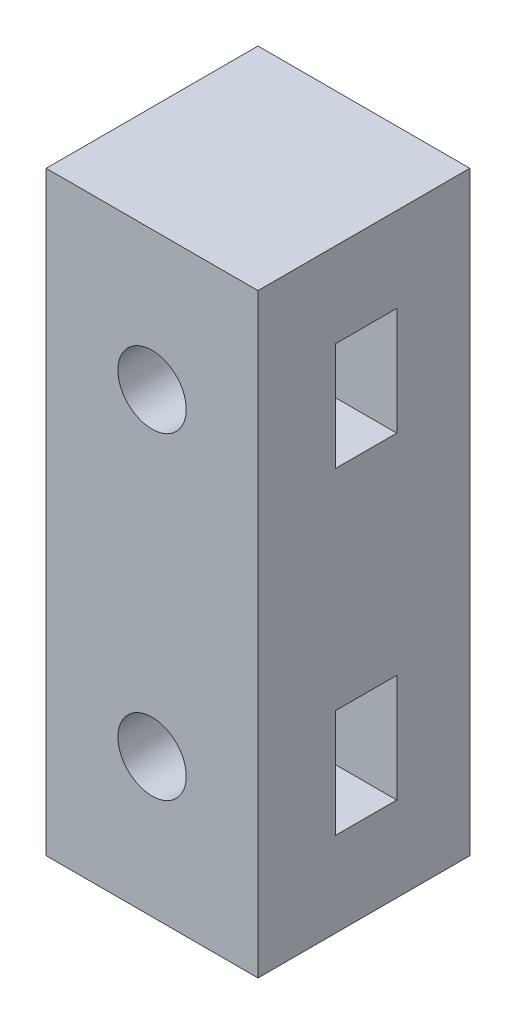
ISO-10303-21;
HEADER;
FILE_DESCRIPTION(('STEP AP214'),'2;1');
FILE_NAME('part.step','',(''),(''),'','','');
FILE_SCHEMA(('AUTOMOTIVE_DESIGN { 1 0 10303 214 1 1 1 1 }'));
ENDSEC;
DATA;
#1=APPLICATION_CONTEXT('core data for automotive mechanical design processes');
#2=APPLICATION_PROTOCOL_DEFINITION('international standard','automotive_design',2000,#1);
#3=PRODUCT_CONTEXT('',#1,'mechanical');
#4=PRODUCT('Part','Part','',(#3));
#5=PRODUCT_RELATED_PRODUCT_CATEGORY('part','',(#4));
#6=PRODUCT_DEFINITION_FORMATION('','',#4);
#7=PRODUCT_DEFINITION_CONTEXT('part definition',#1,'design');
#8=PRODUCT_DEFINITION('design','',#6,#7);
#9=PRODUCT_DEFINITION_SHAPE('','',#8);
#10=(LENGTH_UNIT() NAMED_UNIT(*) SI_UNIT(.MILLI.,.METRE.));
#11=(NAMED_UNIT(*) PLANE_ANGLE_UNIT() SI_UNIT($,.RADIAN.));
#12=(NAMED_UNIT(*) SI_UNIT($,.STERADIAN.) SOLID_ANGLE_UNIT());
#13=UNCERTAINTY_MEASURE_WITH_UNIT(LENGTH_MEASURE(1.E-05),#10,'distance_accuracy_value','');
#14=(GEOMETRIC_REPRESENTATION_CONTEXT(3) GLOBAL_UNCERTAINTY_ASSIGNED_CONTEXT((#13)) GLOBAL_UNIT_ASSIGNED_CONTEXT((#10,
#11,#12)) REPRESENTATION_CONTEXT('',''));
#15=CARTESIAN_POINT('',(0.,0.,0.));
#16=DIRECTION('',(0.,0.,1.));
#17=DIRECTION('',(1.,0.,0.));
#18=AXIS2_PLACEMENT_3D('',#15,#16,#17);
#19=CARTESIAN_POINT('',(25.4,71.374,0.));
#20=DIRECTION('',(-1.,0.,0.));
#21=DIRECTION('',(0.,0.,1.));
#22=AXIS2_PLACEMENT_3D('',#19,#20,#21);
#23=PLANE('',#22);
#24=DIRECTION('',(0.,1.,0.));
#25=VECTOR('',#24,1.);
#26=CARTESIAN_POINT('',(25.4,0.,-9.271));
#27=LINE('',#26,#25);
#28=CARTESIAN_POINT('',(25.4,10.16,-9.271));
#29=VERTEX_POINT('',#28);
#30=CARTESIAN_POINT('',(25.4,23.114,-9.271));
#31=VERTEX_POINT('',#30);
#32=EDGE_CURVE('E81',#29,#31,#27,.T.);
#33=ORIENTED_EDGE('',*,*,#32,.T.);
#34=DIRECTION('',(0.,0.,-1.));
#35=VECTOR('',#34,1.);
#36=CARTESIAN_POINT('',(25.4,23.114,0.));
#37=LINE('',#36,#35);
#38=CARTESIAN_POINT('',(25.4,23.114,-16.637));
#39=VERTEX_POINT('',#38);
#40=EDGE_CURVE('E191',#31,#39,#37,.T.);
#41=ORIENTED_EDGE('',*,*,#40,.T.);
#42=DIRECTION('',(0.,1.,0.));
#43=VECTOR('',#42,1.);
#44=CARTESIAN_POINT('',(25.4,0.,-16.637));
#45=LINE('',#44,#43);
#46=CARTESIAN_POINT('',(25.4,10.16,-16.637));
#47=VERTEX_POINT('',#46);
#48=EDGE_CURVE('E204',#47,#39,#45,.T.);
#49=ORIENTED_EDGE('',*,*,#48,.F.);
#50=DIRECTION('',(0.,0.,-1.));
#51=VECTOR('',#50,1.);
#52=CARTESIAN_POINT('',(25.4,10.16,0.));
#53=LINE('',#52,#51);
#54=EDGE_CURVE('E201',#29,#47,#53,.T.);
#55=ORIENTED_EDGE('',*,*,#54,.F.);
#56=EDGE_LOOP('',(#33,#41,#49,#55));
#57=FACE_BOUND('',#56,.T.);
#58=DIRECTION('',(0.,0.,-1.));
#59=VECTOR('',#58,1.);
#60=CARTESIAN_POINT('',(25.4,0.,0.));
#61=LINE('',#60,#59);
#62=CARTESIAN_POINT('',(25.4,0.,0.));
#63=VERTEX_POINT('',#62);
#64=CARTESIAN_POINT('',(25.4,0.,-25.4));
#65=VERTEX_POINT('',#64);
#66=EDGE_CURVE('E246',#63,#65,#61,.T.);
#67=ORIENTED_EDGE('',*,*,#66,.T.);
#68=DIRECTION('',(0.,-1.,0.));
#69=VECTOR('',#68,1.);
#70=CARTESIAN_POINT('',(25.4,71.374,-25.4));
#71=LINE('',#70,#69);
#72=CARTESIAN_POINT('',(25.4,71.374,-25.4));
#73=VERTEX_POINT('',#72);
#74=EDGE_CURVE('E65',#73,#65,#71,.T.);
#75=ORIENTED_EDGE('',*,*,#74,.F.);
#76=DIRECTION('',(0.,0.,-1.));
#77=VECTOR('',#76,1.);
#78=CARTESIAN_POINT('',(25.4,71.374,0.));
#79=LINE('',#78,#77);
#80=CARTESIAN_POINT('',(25.4,71.374,0.));
#81=VERTEX_POINT('',#80);
#82=EDGE_CURVE('E234',#81,#73,#79,.T.);
#83=ORIENTED_EDGE('',*,*,#82,.F.);
#84=DIRECTION('',(0.,-1.,0.));
#85=VECTOR('',#84,1.);
#86=CARTESIAN_POINT('',(25.4,71.374,0.));
#87=LINE('',#86,#85);
#88=EDGE_CURVE('E12',#81,#63,#87,.T.);
#89=ORIENTED_EDGE('',*,*,#88,.T.);
#90=EDGE_LOOP('',(#67,#75,#83,#89));
#91=FACE_BOUND('',#90,.T.);
#92=DIRECTION('',(0.,0.,-1.));
#93=VECTOR('',#92,1.);
#94=CARTESIAN_POINT('',(25.4,61.214,0.));
#95=LINE('',#94,#93);
#96=CARTESIAN_POINT('',(25.4,61.214,-9.271));
#97=VERTEX_POINT('',#96);
#98=CARTESIAN_POINT('',(25.4,61.214,-16.637));
#99=VERTEX_POINT('',#98);
#100=EDGE_CURVE('E158',#97,#99,#95,.T.);
#101=ORIENTED_EDGE('',*,*,#100,.T.);
#102=DIRECTION('',(0.,-1.,0.));
#103=VECTOR('',#102,1.);
#104=CARTESIAN_POINT('',(25.4,61.214,-16.637));
#105=LINE('',#104,#103);
#106=CARTESIAN_POINT('',(25.4,48.26,-16.637));
#107=VERTEX_POINT('',#106);
#108=EDGE_CURVE('E154',#99,#107,#105,.T.);
#109=ORIENTED_EDGE('',*,*,#108,.T.);
#110=DIRECTION('',(0.,0.,-1.));
#111=VECTOR('',#110,1.);
#112=CARTESIAN_POINT('',(25.4,48.26,-9.271));
#113=LINE('',#112,#111);
#114=CARTESIAN_POINT('',(25.4,48.26,-9.271));
#115=VERTEX_POINT('',#114);
#116=EDGE_CURVE('E161',#115,#107,#113,.T.);
#117=ORIENTED_EDGE('',*,*,#116,.F.);
#118=DIRECTION('',(0.,-1.,0.));
#119=VECTOR('',#118,1.);
#120=CARTESIAN_POINT('',(25.4,61.214,-9.271));
#121=LINE('',#120,#119);
#122=EDGE_CURVE('E165',#97,#115,#121,.T.);
#123=ORIENTED_EDGE('',*,*,#122,.F.);
#124=EDGE_LOOP('',(#101,#109,#117,#123));
#125=FACE_BOUND('',#124,.T.);
#126=ADVANCED_FACE('F56',(#57,#91,#125),#23,.F.);
#127=CARTESIAN_POINT('',(12.7,16.637,-19.05));
#128=DIRECTION('',(0.,0.,1.));
#129=DIRECTION('',(1.,0.,0.));
#130=AXIS2_PLACEMENT_3D('',#127,#128,#129);
#131=CYLINDRICAL_SURFACE('',#130,4.09575);
#132=CARTESIAN_POINT('',(12.7,16.637,0.));
#133=DIRECTION('',(0.,0.,1.));
#134=DIRECTION('',(1.,0.,0.));
#135=AXIS2_PLACEMENT_3D('',#132,#133,#134);
#136=CIRCLE('',#135,4.09575);
#137=CARTESIAN_POINT('',(16.79575,16.637,0.));
#138=VERTEX_POINT('',#137);
#139=EDGE_CURVE('E221',#138,#138,#136,.T.);
#140=CARTESIAN_POINT('',(12.7,16.637,-9.271));
#141=DIRECTION('',(0.,0.,-1.));
#142=DIRECTION('',(0.,1.,0.));
#143=AXIS2_PLACEMENT_3D('',#140,#141,#142);
#144=CIRCLE('',#143,4.09575);
#145=CARTESIAN_POINT('',(16.79575,16.637,-9.271));
#146=VERTEX_POINT('',#145);
#147=EDGE_CURVE('E224',#146,#146,#144,.F.);
#148=CARTESIAN_POINT('',(16.79575,16.637,0.));
#149=CARTESIAN_POINT('',(16.79575,16.637,-0.096572916666667));
#150=CARTESIAN_POINT('',(16.79575,16.637,-0.193145833333334));
#151=CARTESIAN_POINT('',(16.79575,16.637,-0.386291666666668));
#152=CARTESIAN_POINT('',(16.79575,16.637,-0.482864583333335));
#153=CARTESIAN_POINT('',(16.79575,16.637,-0.676010416666668));
#154=CARTESIAN_POINT('',(16.79575,16.637,-0.772583333333333));
#155=CARTESIAN_POINT('',(16.79575,16.637,-0.965729166666666));
#156=CARTESIAN_POINT('',(16.79575,16.637,-1.06230208333333));
#157=CARTESIAN_POINT('',(16.79575,16.637,-1.25544791666667));
#158=CARTESIAN_POINT('',(16.79575,16.637,-1.35202083333333));
#159=CARTESIAN_POINT('',(16.79575,16.637,-1.54516666666667));
#160=CARTESIAN_POINT('',(16.79575,16.637,-1.64173958333334));
#161=CARTESIAN_POINT('',(16.79575,16.637,-1.83488541666667));
#162=CARTESIAN_POINT('',(16.79575,16.637,-1.93145833333333));
#163=CARTESIAN_POINT('',(16.79575,16.637,-2.12460416666667));
#164=CARTESIAN_POINT('',(16.79575,16.637,-2.22117708333333));
#165=CARTESIAN_POINT('',(16.79575,16.637,-2.41432291666667));
#166=CARTESIAN_POINT('',(16.79575,16.637,-2.51089583333333));
#167=CARTESIAN_POINT('',(16.79575,16.637,-2.70404166666667));
#168=CARTESIAN_POINT('',(16.79575,16.637,-2.80061458333333));
#169=CARTESIAN_POINT('',(16.79575,16.637,-2.99376041666667));
#170=CARTESIAN_POINT('',(16.79575,16.637,-3.09033333333334));
#171=CARTESIAN_POINT('',(16.79575,16.637,-3.28347916666667));
#172=CARTESIAN_POINT('',(16.79575,16.637,-3.38005208333333));
#173=CARTESIAN_POINT('',(16.79575,16.637,-3.57319791666667));
#174=CARTESIAN_POINT('',(16.79575,16.637,-3.66977083333333));
#175=CARTESIAN_POINT('',(16.79575,16.637,-3.86291666666667));
#176=CARTESIAN_POINT('',(16.79575,16.637,-3.95948958333333));
#177=CARTESIAN_POINT('',(16.79575,16.637,-4.15263541666667));
#178=CARTESIAN_POINT('',(16.79575,16.637,-4.24920833333333));
#179=CARTESIAN_POINT('',(16.79575,16.637,-4.44235416666667));
#180=CARTESIAN_POINT('',(16.79575,16.637,-4.53892708333333));
#181=CARTESIAN_POINT('',(16.79575,16.637,-4.73207291666667));
#182=CARTESIAN_POINT('',(16.79575,16.637,-4.82864583333333));
#183=CARTESIAN_POINT('',(16.79575,16.637,-5.02179166666667));
#184=CARTESIAN_POINT('',(16.79575,16.637,-5.11836458333333));
#185=CARTESIAN_POINT('',(16.79575,16.637,-5.31151041666667));
#186=CARTESIAN_POINT('',(16.79575,16.637,-5.40808333333333));
#187=CARTESIAN_POINT('',(16.79575,16.637,-5.60122916666667));
#188=CARTESIAN_POINT('',(16.79575,16.637,-5.69780208333333));
#189=CARTESIAN_POINT('',(16.79575,16.637,-5.89094791666667));
#190=CARTESIAN_POINT('',(16.79575,16.637,-5.98752083333333));
#191=CARTESIAN_POINT('',(16.79575,16.637,-6.18066666666667));
#192=CARTESIAN_POINT('',(16.79575,16.637,-6.27723958333333));
#193=CARTESIAN_POINT('',(16.79575,16.637,-6.47038541666667));
#194=CARTESIAN_POINT('',(16.79575,16.637,-6.56695833333334));
#195=CARTESIAN_POINT('',(16.79575,16.637,-6.76010416666667));
#196=CARTESIAN_POINT('',(16.79575,16.637,-6.85667708333334));
#197=CARTESIAN_POINT('',(16.79575,16.637,-7.04982291666667));
#198=CARTESIAN_POINT('',(16.79575,16.637,-7.14639583333334));
#199=CARTESIAN_POINT('',(16.79575,16.637,-7.33954166666667));
#200=CARTESIAN_POINT('',(16.79575,16.637,-7.43611458333333));
#201=CARTESIAN_POINT('',(16.79575,16.637,-7.62926041666667));
#202=CARTESIAN_POINT('',(16.79575,16.637,-7.72583333333334));
#203=CARTESIAN_POINT('',(16.79575,16.637,-7.91897916666667));
#204=CARTESIAN_POINT('',(16.79575,16.637,-8.01555208333334));
#205=CARTESIAN_POINT('',(16.79575,16.637,-8.20869791666667));
#206=CARTESIAN_POINT('',(16.79575,16.637,-8.30527083333334));
#207=CARTESIAN_POINT('',(16.79575,16.637,-8.49841666666667));
#208=CARTESIAN_POINT('',(16.79575,16.637,-8.59498958333334));
#209=CARTESIAN_POINT('',(16.79575,16.637,-8.78813541666667));
#210=CARTESIAN_POINT('',(16.79575,16.637,-8.88470833333334));
#211=CARTESIAN_POINT('',(16.79575,16.637,-9.07785416666667));
#212=CARTESIAN_POINT('',(16.79575,16.637,-9.17442708333334));
#213=CARTESIAN_POINT('',(16.79575,16.637,-9.271));
#214=B_SPLINE_CURVE_WITH_KNOTS('',3,(#148,#149,#150,#151,#152,#153,#154,#155,#156,#157,#158,
#159,#160,#161,#162,#163,#164,#165,#166,#167,#168,#169,#170,#171,#172,#173,#174,#175,#176,#177,
#178,#179,#180,#181,#182,#183,#184,#185,#186,#187,#188,#189,#190,#191,#192,#193,#194,#195,#196,
#197,#198,#199,#200,#201,#202,#203,#204,#205,#206,#207,#208,#209,#210,#211,#212,#213),
.UNSPECIFIED.,.F.,.F.,(4,2,2,2,2,2,2,2,2,2,2,2,2,2,2,2,2,2,2,2,2,2,2,2,2,2,2,2,2,2,2,2,4),(0.,
0.289718750000001,0.579437500000002,0.869156249999999,1.158875,1.44859375,1.7383125,2.02803125,
2.31775,2.60746875,2.8971875,3.18690625,3.476625,3.76634375,4.0560625,4.34578125,4.6355,
4.92521875,5.2149375,5.50465625,5.794375,6.08409375,6.3738125,6.66353125,6.95325,7.24296875,
7.5326875,7.82240625,8.112125,8.40184375,8.6915625,8.98128125,9.271),.UNSPECIFIED.);
#215=EDGE_CURVE('BSEAM265',#138,#146,#214,.T.);
#216=ORIENTED_EDGE('',*,*,#139,.T.);
#217=ORIENTED_EDGE('',*,*,#147,.F.);
#218=ORIENTED_EDGE('',*,*,#215,.T.);
#219=ORIENTED_EDGE('',*,*,#215,.F.);
#220=EDGE_LOOP('',(#216,#218,#217,#219));
#221=FACE_BOUND('',#220,.T.);
#222=ADVANCED_FACE('F265',(#221),#131,.F.);
#223=CARTESIAN_POINT('',(0.,71.374,0.));
#224=DIRECTION('',(0.,0.,-1.));
#225=DIRECTION('',(-1.,0.,0.));
#226=AXIS2_PLACEMENT_3D('',#223,#224,#225);
#227=PLANE('',#226);
#228=ORIENTED_EDGE('',*,*,#139,.F.);
#229=EDGE_LOOP('',(#228));
#230=FACE_BOUND('',#229,.T.);
#231=CARTESIAN_POINT('',(12.7,54.737,0.));
#232=DIRECTION('',(0.,0.,1.));
#233=DIRECTION('',(1.,0.,0.));
#234=AXIS2_PLACEMENT_3D('',#231,#232,#233);
#235=CIRCLE('',#234,4.09575);
#236=CARTESIAN_POINT('',(16.79575,54.737,0.));
#237=VERTEX_POINT('',#236);
#238=EDGE_CURVE('E220',#237,#237,#235,.T.);
#239=ORIENTED_EDGE('',*,*,#238,.F.);
#240=EDGE_LOOP('',(#239));
#241=FACE_BOUND('',#240,.T.);
#242=DIRECTION('',(1.,0.,0.));
#243=VECTOR('',#242,1.);
#244=CARTESIAN_POINT('',(0.,0.,0.));
#245=LINE('',#244,#243);
#246=CARTESIAN_POINT('',(0.,0.,0.));
#247=VERTEX_POINT('',#246);
#248=EDGE_CURVE('E228',#247,#63,#245,.T.);
#249=ORIENTED_EDGE('',*,*,#248,.T.);
#250=ORIENTED_EDGE('',*,*,#88,.F.);
#251=DIRECTION('',(1.,0.,0.));
#252=VECTOR('',#251,1.);
#253=CARTESIAN_POINT('',(0.,71.374,0.));
#254=LINE('',#253,#252);
#255=CARTESIAN_POINT('',(0.,71.374,0.));
#256=VERTEX_POINT('',#255);
#257=EDGE_CURVE('E231',#256,#81,#254,.T.);
#258=ORIENTED_EDGE('',*,*,#257,.F.);
#259=DIRECTION('',(0.,-1.,0.));
#260=VECTOR('',#259,1.);
#261=CARTESIAN_POINT('',(0.,71.374,0.));
#262=LINE('',#261,#260);
#263=EDGE_CURVE('E243',#256,#247,#262,.T.);
#264=ORIENTED_EDGE('',*,*,#263,.T.);
#265=EDGE_LOOP('',(#249,#250,#258,#264));
#266=FACE_BOUND('',#265,.T.);
#267=ADVANCED_FACE('F58',(#230,#241,#266),#227,.F.);
#268=CARTESIAN_POINT('',(0.,71.374,-25.4));
#269=DIRECTION('',(0.,0.,-1.));
#270=DIRECTION('',(-1.,0.,0.));
#271=AXIS2_PLACEMENT_3D('',#268,#269,#270);
#272=PLANE('',#271);
#273=DIRECTION('',(1.,0.,0.));
#274=VECTOR('',#273,1.);
#275=CARTESIAN_POINT('',(0.,0.,-25.4));
#276=LINE('',#275,#274);
#277=CARTESIAN_POINT('',(0.,0.,-25.4));
#278=VERTEX_POINT('',#277);
#279=EDGE_CURVE('E249',#278,#65,#276,.T.);
#280=ORIENTED_EDGE('',*,*,#279,.F.);
#281=DIRECTION('',(0.,-1.,0.));
#282=VECTOR('',#281,1.);
#283=CARTESIAN_POINT('',(0.,71.374,-25.4));
#284=LINE('',#283,#282);
#285=CARTESIAN_POINT('',(0.,71.374,-25.4));
#286=VERTEX_POINT('',#285);
#287=EDGE_CURVE('E255',#286,#278,#284,.T.);
#288=ORIENTED_EDGE('',*,*,#287,.F.);
#289=DIRECTION('',(1.,0.,0.));
#290=VECTOR('',#289,1.);
#291=CARTESIAN_POINT('',(0.,71.374,-25.4));
#292=LINE('',#291,#290);
#293=EDGE_CURVE('E237',#286,#73,#292,.T.);
#294=ORIENTED_EDGE('',*,*,#293,.T.);
#295=ORIENTED_EDGE('',*,*,#74,.T.);
#296=EDGE_LOOP('',(#280,#288,#294,#295));
#297=FACE_BOUND('',#296,.T.);
#298=ADVANCED_FACE('F274',(#297),#272,.T.);
#299=CARTESIAN_POINT('',(0.,71.374,0.));
#300=DIRECTION('',(-1.,0.,0.));
#301=DIRECTION('',(0.,0.,1.));
#302=AXIS2_PLACEMENT_3D('',#299,#300,#301);
#303=PLANE('',#302);
#304=DIRECTION('',(0.,0.,-1.));
#305=VECTOR('',#304,1.);
#306=CARTESIAN_POINT('',(0.,0.,0.));
#307=LINE('',#306,#305);
#308=EDGE_CURVE('E235',#247,#278,#307,.T.);
#309=ORIENTED_EDGE('',*,*,#308,.F.);
#310=ORIENTED_EDGE('',*,*,#263,.F.);
#311=DIRECTION('',(0.,0.,-1.));
#312=VECTOR('',#311,1.);
#313=CARTESIAN_POINT('',(0.,71.374,0.));
#314=LINE('',#313,#312);
#315=EDGE_CURVE('E240',#256,#286,#314,.T.);
#316=ORIENTED_EDGE('',*,*,#315,.T.);
#317=ORIENTED_EDGE('',*,*,#287,.T.);
#318=EDGE_LOOP('',(#309,#310,#316,#317));
#319=FACE_BOUND('',#318,.T.);
#320=ADVANCED_FACE('F337',(#319),#303,.T.);
#321=CARTESIAN_POINT('',(0.,71.374,0.));
#322=DIRECTION('',(0.,1.,0.));
#323=DIRECTION('',(0.,0.,1.));
#324=AXIS2_PLACEMENT_3D('',#321,#322,#323);
#325=PLANE('',#324);
#326=ORIENTED_EDGE('',*,*,#257,.T.);
#327=ORIENTED_EDGE('',*,*,#82,.T.);
#328=ORIENTED_EDGE('',*,*,#293,.F.);
#329=ORIENTED_EDGE('',*,*,#315,.F.);
#330=EDGE_LOOP('',(#326,#327,#328,#329));
#331=FACE_BOUND('',#330,.T.);
#332=ADVANCED_FACE('F335',(#331),#325,.T.);
#333=CARTESIAN_POINT('',(0.,0.,0.));
#334=DIRECTION('',(0.,1.,0.));
#335=DIRECTION('',(0.,0.,1.));
#336=AXIS2_PLACEMENT_3D('',#333,#334,#335);
#337=PLANE('',#336);
#338=ORIENTED_EDGE('',*,*,#248,.F.);
#339=ORIENTED_EDGE('',*,*,#308,.T.);
#340=ORIENTED_EDGE('',*,*,#279,.T.);
#341=ORIENTED_EDGE('',*,*,#66,.F.);
#342=EDGE_LOOP('',(#338,#339,#340,#341));
#343=FACE_BOUND('',#342,.T.);
#344=ADVANCED_FACE('F329',(#343),#337,.F.);
#345=CARTESIAN_POINT('',(12.7,54.737,-19.05));
#346=DIRECTION('',(0.,0.,1.));
#347=DIRECTION('',(1.,0.,0.));
#348=AXIS2_PLACEMENT_3D('',#345,#346,#347);
#349=CYLINDRICAL_SURFACE('',#348,4.09575);
#350=CARTESIAN_POINT('',(12.7,54.737,-9.27100000000001));
#351=DIRECTION('',(0.,0.,1.));
#352=DIRECTION('',(0.,-1.,0.));
#353=AXIS2_PLACEMENT_3D('',#350,#351,#352);
#354=CIRCLE('',#353,4.09575);
#355=CARTESIAN_POINT('',(16.79575,54.737,-9.27100000000001));
#356=VERTEX_POINT('',#355);
#357=EDGE_CURVE('E169',#356,#356,#354,.F.);
#358=CARTESIAN_POINT('',(16.79575,54.737,-9.27100000000001));
#359=CARTESIAN_POINT('',(16.79575,54.737,-9.17442708333334));
#360=CARTESIAN_POINT('',(16.79575,54.737,-9.07785416666667));
#361=CARTESIAN_POINT('',(16.79575,54.737,-8.88470833333334));
#362=CARTESIAN_POINT('',(16.79575,54.737,-8.78813541666667));
#363=CARTESIAN_POINT('',(16.79575,54.737,-8.59498958333334));
#364=CARTESIAN_POINT('',(16.79575,54.737,-8.49841666666667));
#365=CARTESIAN_POINT('',(16.79575,54.737,-8.30527083333334));
#366=CARTESIAN_POINT('',(16.79575,54.737,-8.20869791666667));
#367=CARTESIAN_POINT('',(16.79575,54.737,-8.01555208333334));
#368=CARTESIAN_POINT('',(16.79575,54.737,-7.91897916666667));
#369=CARTESIAN_POINT('',(16.79575,54.737,-7.72583333333334));
#370=CARTESIAN_POINT('',(16.79575,54.737,-7.62926041666667));
#371=CARTESIAN_POINT('',(16.79575,54.737,-7.43611458333334));
#372=CARTESIAN_POINT('',(16.79575,54.737,-7.33954166666667));
#373=CARTESIAN_POINT('',(16.79575,54.737,-7.14639583333334));
#374=CARTESIAN_POINT('',(16.79575,54.737,-7.04982291666667));
#375=CARTESIAN_POINT('',(16.79575,54.737,-6.85667708333334));
#376=CARTESIAN_POINT('',(16.79575,54.737,-6.76010416666667));
#377=CARTESIAN_POINT('',(16.79575,54.737,-6.56695833333334));
#378=CARTESIAN_POINT('',(16.79575,54.737,-6.47038541666667));
#379=CARTESIAN_POINT('',(16.79575,54.737,-6.27723958333334));
#380=CARTESIAN_POINT('',(16.79575,54.737,-6.18066666666667));
#381=CARTESIAN_POINT('',(16.79575,54.737,-5.98752083333334));
#382=CARTESIAN_POINT('',(16.79575,54.737,-5.89094791666667));
#383=CARTESIAN_POINT('',(16.79575,54.737,-5.69780208333334));
#384=CARTESIAN_POINT('',(16.79575,54.737,-5.60122916666667));
#385=CARTESIAN_POINT('',(16.79575,54.737,-5.40808333333334));
#386=CARTESIAN_POINT('',(16.79575,54.737,-5.31151041666667));
#387=CARTESIAN_POINT('',(16.79575,54.737,-5.11836458333334));
#388=CARTESIAN_POINT('',(16.79575,54.737,-5.02179166666667));
#389=CARTESIAN_POINT('',(16.79575,54.737,-4.82864583333334));
#390=CARTESIAN_POINT('',(16.79575,54.737,-4.73207291666667));
#391=CARTESIAN_POINT('',(16.79575,54.737,-4.53892708333334));
#392=CARTESIAN_POINT('',(16.79575,54.737,-4.44235416666667));
#393=CARTESIAN_POINT('',(16.79575,54.737,-4.24920833333333));
#394=CARTESIAN_POINT('',(16.79575,54.737,-4.15263541666667));
#395=CARTESIAN_POINT('',(16.79575,54.737,-3.95948958333334));
#396=CARTESIAN_POINT('',(16.79575,54.737,-3.86291666666667));
#397=CARTESIAN_POINT('',(16.79575,54.737,-3.66977083333334));
#398=CARTESIAN_POINT('',(16.79575,54.737,-3.57319791666667));
#399=CARTESIAN_POINT('',(16.79575,54.737,-3.38005208333334));
#400=CARTESIAN_POINT('',(16.79575,54.737,-3.28347916666667));
#401=CARTESIAN_POINT('',(16.79575,54.737,-3.09033333333334));
#402=CARTESIAN_POINT('',(16.79575,54.737,-2.99376041666667));
#403=CARTESIAN_POINT('',(16.79575,54.737,-2.80061458333333));
#404=CARTESIAN_POINT('',(16.79575,54.737,-2.70404166666667));
#405=CARTESIAN_POINT('',(16.79575,54.737,-2.51089583333333));
#406=CARTESIAN_POINT('',(16.79575,54.737,-2.41432291666667));
#407=CARTESIAN_POINT('',(16.79575,54.737,-2.22117708333333));
#408=CARTESIAN_POINT('',(16.79575,54.737,-2.12460416666667));
#409=CARTESIAN_POINT('',(16.79575,54.737,-1.93145833333334));
#410=CARTESIAN_POINT('',(16.79575,54.737,-1.83488541666667));
#411=CARTESIAN_POINT('',(16.79575,54.737,-1.64173958333334));
#412=CARTESIAN_POINT('',(16.79575,54.737,-1.54516666666667));
#413=CARTESIAN_POINT('',(16.79575,54.737,-1.35202083333333));
#414=CARTESIAN_POINT('',(16.79575,54.737,-1.25544791666667));
#415=CARTESIAN_POINT('',(16.79575,54.737,-1.06230208333333));
#416=CARTESIAN_POINT('',(16.79575,54.737,-0.965729166666669));
#417=CARTESIAN_POINT('',(16.79575,54.737,-0.772583333333336));
#418=CARTESIAN_POINT('',(16.79575,54.737,-0.676010416666669));
#419=CARTESIAN_POINT('',(16.79575,54.737,-0.482864583333335));
#420=CARTESIAN_POINT('',(16.79575,54.737,-0.386291666666668));
#421=CARTESIAN_POINT('',(16.79575,54.737,-0.193145833333334));
#422=CARTESIAN_POINT('',(16.79575,54.737,-0.096572916666667));
#423=CARTESIAN_POINT('',(16.79575,54.737,0.));
#424=B_SPLINE_CURVE_WITH_KNOTS('',3,(#358,#359,#360,#361,#362,#363,#364,#365,#366,#367,#368,
#369,#370,#371,#372,#373,#374,#375,#376,#377,#378,#379,#380,#381,#382,#383,#384,#385,#386,#387,
#388,#389,#390,#391,#392,#393,#394,#395,#396,#397,#398,#399,#400,#401,#402,#403,#404,#405,#406,
#407,#408,#409,#410,#411,#412,#413,#414,#415,#416,#417,#418,#419,#420,#421,#422,#423),
.UNSPECIFIED.,.F.,.F.,(4,2,2,2,2,2,2,2,2,2,2,2,2,2,2,2,2,2,2,2,2,2,2,2,2,2,2,2,2,2,2,2,4),(0.,
0.289718750000001,0.5794375,0.869156250000001,1.158875,1.44859375,1.7383125,2.02803125,2.31775,
2.60746875,2.8971875,3.18690625,3.476625,3.76634375,4.0560625,4.34578125,4.6355,
4.92521875000001,5.2149375,5.50465625000001,5.794375,6.08409375,6.3738125,6.66353125000001,
6.95325000000001,7.24296875,7.53268750000001,7.82240625000001,8.11212500000001,8.40184375,
8.69156250000001,8.98128125000001,9.27100000000001),.UNSPECIFIED.);
#425=EDGE_CURVE('BSEAM306',#356,#237,#424,.T.);
#426=ORIENTED_EDGE('',*,*,#357,.T.);
#427=ORIENTED_EDGE('',*,*,#238,.T.);
#428=ORIENTED_EDGE('',*,*,#425,.T.);
#429=ORIENTED_EDGE('',*,*,#425,.F.);
#430=EDGE_LOOP('',(#426,#428,#427,#429));
#431=FACE_BOUND('',#430,.T.);
#432=ADVANCED_FACE('F306',(#431),#349,.F.);
#433=CARTESIAN_POINT('',(6.35,0.,-9.271));
#434=DIRECTION('',(0.,0.,-1.));
#435=DIRECTION('',(0.,1.,0.));
#436=AXIS2_PLACEMENT_3D('',#433,#434,#435);
#437=PLANE('',#436);
#438=ORIENTED_EDGE('',*,*,#32,.F.);
#439=DIRECTION('',(1.,0.,0.));
#440=VECTOR('',#439,1.);
#441=CARTESIAN_POINT('',(6.35,10.16,-9.271));
#442=LINE('',#441,#440);
#443=CARTESIAN_POINT('',(6.35,10.16,-9.271));
#444=VERTEX_POINT('',#443);
#445=EDGE_CURVE('E199',#444,#29,#442,.T.);
#446=ORIENTED_EDGE('',*,*,#445,.F.);
#447=DIRECTION('',(0.,1.,0.));
#448=VECTOR('',#447,1.);
#449=CARTESIAN_POINT('',(6.35,0.,-9.271));
#450=LINE('',#449,#448);
#451=CARTESIAN_POINT('',(6.35,23.114,-9.271));
#452=VERTEX_POINT('',#451);
#453=EDGE_CURVE('E187',#444,#452,#450,.T.);
#454=ORIENTED_EDGE('',*,*,#453,.T.);
#455=DIRECTION('',(1.,0.,0.));
#456=VECTOR('',#455,1.);
#457=CARTESIAN_POINT('',(6.35,23.114,-9.271));
#458=LINE('',#457,#456);
#459=EDGE_CURVE('E209',#452,#31,#458,.T.);
#460=ORIENTED_EDGE('',*,*,#459,.T.);
#461=EDGE_LOOP('',(#438,#446,#454,#460));
#462=FACE_BOUND('',#461,.T.);
#463=ORIENTED_EDGE('',*,*,#147,.T.);
#464=EDGE_LOOP('',(#463));
#465=FACE_BOUND('',#464,.T.);
#466=ADVANCED_FACE('F263',(#462,#465),#437,.T.);
#467=CARTESIAN_POINT('',(6.35,0.,-16.637));
#468=DIRECTION('',(0.,0.,-1.));
#469=DIRECTION('',(-1.,0.,0.));
#470=AXIS2_PLACEMENT_3D('',#467,#468,#469);
#471=PLANE('',#470);
#472=ORIENTED_EDGE('',*,*,#48,.T.);
#473=DIRECTION('',(1.,0.,0.));
#474=VECTOR('',#473,1.);
#475=CARTESIAN_POINT('',(6.35,23.114,-16.637));
#476=LINE('',#475,#474);
#477=CARTESIAN_POINT('',(6.35,23.114,-16.637));
#478=VERTEX_POINT('',#477);
#479=EDGE_CURVE('E212',#478,#39,#476,.T.);
#480=ORIENTED_EDGE('',*,*,#479,.F.);
#481=DIRECTION('',(0.,1.,0.));
#482=VECTOR('',#481,1.);
#483=CARTESIAN_POINT('',(6.35,0.,-16.637));
#484=LINE('',#483,#482);
#485=CARTESIAN_POINT('',(6.35,10.16,-16.637));
#486=VERTEX_POINT('',#485);
#487=EDGE_CURVE('E194',#486,#478,#484,.T.);
#488=ORIENTED_EDGE('',*,*,#487,.F.);
#489=DIRECTION('',(1.,0.,0.));
#490=VECTOR('',#489,1.);
#491=CARTESIAN_POINT('',(6.35,10.16,-16.637));
#492=LINE('',#491,#490);
#493=EDGE_CURVE('E214',#486,#47,#492,.T.);
#494=ORIENTED_EDGE('',*,*,#493,.T.);
#495=EDGE_LOOP('',(#472,#480,#488,#494));
#496=FACE_BOUND('',#495,.T.);
#497=CARTESIAN_POINT('',(12.7,16.637,-16.637));
#498=DIRECTION('',(0.,0.,-1.));
#499=DIRECTION('',(-1.,0.,0.));
#500=AXIS2_PLACEMENT_3D('',#497,#498,#499);
#501=CIRCLE('',#500,4.09575);
#502=CARTESIAN_POINT('',(16.79575,16.637,-16.637));
#503=VERTEX_POINT('',#502);
#504=EDGE_CURVE('E211',#503,#503,#501,.F.);
#505=ORIENTED_EDGE('',*,*,#504,.F.);
#506=EDGE_LOOP('',(#505));
#507=FACE_BOUND('',#506,.T.);
#508=ADVANCED_FACE('F294',(#496,#507),#471,.F.);
#509=CARTESIAN_POINT('',(6.35,23.114,0.));
#510=DIRECTION('',(0.,-1.,0.));
#511=DIRECTION('',(0.,0.,-1.));
#512=AXIS2_PLACEMENT_3D('',#509,#510,#511);
#513=PLANE('',#512);
#514=ORIENTED_EDGE('',*,*,#40,.F.);
#515=ORIENTED_EDGE('',*,*,#459,.F.);
#516=DIRECTION('',(0.,0.,-1.));
#517=VECTOR('',#516,1.);
#518=CARTESIAN_POINT('',(6.35,23.114,0.));
#519=LINE('',#518,#517);
#520=EDGE_CURVE('E197',#452,#478,#519,.T.);
#521=ORIENTED_EDGE('',*,*,#520,.T.);
#522=ORIENTED_EDGE('',*,*,#479,.T.);
#523=EDGE_LOOP('',(#514,#515,#521,#522));
#524=FACE_BOUND('',#523,.T.);
#525=ADVANCED_FACE('F296',(#524),#513,.T.);
#526=CARTESIAN_POINT('',(6.35,10.16,0.));
#527=DIRECTION('',(0.,-1.,0.));
#528=DIRECTION('',(0.,0.,-1.));
#529=AXIS2_PLACEMENT_3D('',#526,#527,#528);
#530=PLANE('',#529);
#531=ORIENTED_EDGE('',*,*,#54,.T.);
#532=ORIENTED_EDGE('',*,*,#493,.F.);
#533=DIRECTION('',(0.,0.,-1.));
#534=VECTOR('',#533,1.);
#535=CARTESIAN_POINT('',(6.35,10.16,0.));
#536=LINE('',#535,#534);
#537=EDGE_CURVE('E190',#444,#486,#536,.T.);
#538=ORIENTED_EDGE('',*,*,#537,.F.);
#539=ORIENTED_EDGE('',*,*,#445,.T.);
#540=EDGE_LOOP('',(#531,#532,#538,#539));
#541=FACE_BOUND('',#540,.T.);
#542=ADVANCED_FACE('F303',(#541),#530,.F.);
#543=CARTESIAN_POINT('',(6.35,0.,0.));
#544=DIRECTION('',(1.,0.,0.));
#545=DIRECTION('',(0.,0.,-1.));
#546=AXIS2_PLACEMENT_3D('',#543,#544,#545);
#547=PLANE('',#546);
#548=ORIENTED_EDGE('',*,*,#453,.F.);
#549=ORIENTED_EDGE('',*,*,#537,.T.);
#550=ORIENTED_EDGE('',*,*,#487,.T.);
#551=ORIENTED_EDGE('',*,*,#520,.F.);
#552=EDGE_LOOP('',(#548,#549,#550,#551));
#553=FACE_BOUND('',#552,.T.);
#554=ADVANCED_FACE('F288',(#553),#547,.T.);
#555=CARTESIAN_POINT('',(12.7,16.637,-19.05));
#556=DIRECTION('',(0.,0.,1.));
#557=DIRECTION('',(1.,0.,0.));
#558=AXIS2_PLACEMENT_3D('',#555,#556,#557);
#559=PLANE('',#558);
#560=CARTESIAN_POINT('',(12.7,16.637,-19.05));
#561=DIRECTION('',(0.,0.,1.));
#562=DIRECTION('',(1.,0.,0.));
#563=AXIS2_PLACEMENT_3D('',#560,#561,#562);
#564=CIRCLE('',#563,4.09575);
#565=CARTESIAN_POINT('',(16.79575,16.637,-19.05));
#566=VERTEX_POINT('',#565);
#567=EDGE_CURVE('E217',#566,#566,#564,.T.);
#568=ORIENTED_EDGE('',*,*,#567,.T.);
#569=EDGE_LOOP('',(#568));
#570=FACE_BOUND('',#569,.T.);
#571=ADVANCED_FACE('F280',(#570),#559,.T.);
#572=CARTESIAN_POINT('',(16.79575,16.637,-16.637));
#573=CARTESIAN_POINT('',(16.79575,16.637,-16.6621354166667));
#574=CARTESIAN_POINT('',(16.79575,16.637,-16.6872708333333));
#575=CARTESIAN_POINT('',(16.79575,16.637,-16.7375416666667));
#576=CARTESIAN_POINT('',(16.79575,16.637,-16.7626770833333));
#577=CARTESIAN_POINT('',(16.79575,16.637,-16.8129479166667));
#578=CARTESIAN_POINT('',(16.79575,16.637,-16.8380833333333));
#579=CARTESIAN_POINT('',(16.79575,16.637,-16.8883541666667));
#580=CARTESIAN_POINT('',(16.79575,16.637,-16.9134895833333));
#581=CARTESIAN_POINT('',(16.79575,16.637,-16.9637604166667));
#582=CARTESIAN_POINT('',(16.79575,16.637,-16.9888958333333));
#583=CARTESIAN_POINT('',(16.79575,16.637,-17.0391666666667));
#584=CARTESIAN_POINT('',(16.79575,16.637,-17.0643020833333));
#585=CARTESIAN_POINT('',(16.79575,16.637,-17.1145729166667));
#586=CARTESIAN_POINT('',(16.79575,16.637,-17.1397083333333));
#587=CARTESIAN_POINT('',(16.79575,16.637,-17.1899791666667));
#588=CARTESIAN_POINT('',(16.79575,16.637,-17.2151145833333));
#589=CARTESIAN_POINT('',(16.79575,16.637,-17.2653854166667));
#590=CARTESIAN_POINT('',(16.79575,16.637,-17.2905208333333));
#591=CARTESIAN_POINT('',(16.79575,16.637,-17.3407916666667));
#592=CARTESIAN_POINT('',(16.79575,16.637,-17.3659270833333));
#593=CARTESIAN_POINT('',(16.79575,16.637,-17.4161979166667));
#594=CARTESIAN_POINT('',(16.79575,16.637,-17.4413333333333));
#595=CARTESIAN_POINT('',(16.79575,16.637,-17.4916041666667));
#596=CARTESIAN_POINT('',(16.79575,16.637,-17.5167395833333));
#597=CARTESIAN_POINT('',(16.79575,16.637,-17.5670104166667));
#598=CARTESIAN_POINT('',(16.79575,16.637,-17.5921458333333));
#599=CARTESIAN_POINT('',(16.79575,16.637,-17.6424166666667));
#600=CARTESIAN_POINT('',(16.79575,16.637,-17.6675520833333));
#601=CARTESIAN_POINT('',(16.79575,16.637,-17.7178229166667));
#602=CARTESIAN_POINT('',(16.79575,16.637,-17.7429583333333));
#603=CARTESIAN_POINT('',(16.79575,16.637,-17.7932291666667));
#604=CARTESIAN_POINT('',(16.79575,16.637,-17.8183645833333));
#605=CARTESIAN_POINT('',(16.79575,16.637,-17.8686354166667));
#606=CARTESIAN_POINT('',(16.79575,16.637,-17.8937708333333));
#607=CARTESIAN_POINT('',(16.79575,16.637,-17.9440416666667));
#608=CARTESIAN_POINT('',(16.79575,16.637,-17.9691770833333));
#609=CARTESIAN_POINT('',(16.79575,16.637,-18.0194479166667));
#610=CARTESIAN_POINT('',(16.79575,16.637,-18.0445833333333));
#611=CARTESIAN_POINT('',(16.79575,16.637,-18.0948541666667));
#612=CARTESIAN_POINT('',(16.79575,16.637,-18.1199895833333));
#613=CARTESIAN_POINT('',(16.79575,16.637,-18.1702604166667));
#614=CARTESIAN_POINT('',(16.79575,16.637,-18.1953958333333));
#615=CARTESIAN_POINT('',(16.79575,16.637,-18.2456666666667));
#616=CARTESIAN_POINT('',(16.79575,16.637,-18.2708020833333));
#617=CARTESIAN_POINT('',(16.79575,16.637,-18.3210729166667));
#618=CARTESIAN_POINT('',(16.79575,16.637,-18.3462083333333));
#619=CARTESIAN_POINT('',(16.79575,16.637,-18.3964791666667));
#620=CARTESIAN_POINT('',(16.79575,16.637,-18.4216145833333));
#621=CARTESIAN_POINT('',(16.79575,16.637,-18.4718854166667));
#622=CARTESIAN_POINT('',(16.79575,16.637,-18.4970208333333));
#623=CARTESIAN_POINT('',(16.79575,16.637,-18.5472916666667));
#624=CARTESIAN_POINT('',(16.79575,16.637,-18.5724270833333));
#625=CARTESIAN_POINT('',(16.79575,16.637,-18.6226979166667));
#626=CARTESIAN_POINT('',(16.79575,16.637,-18.6478333333333));
#627=CARTESIAN_POINT('',(16.79575,16.637,-18.6981041666667));
#628=CARTESIAN_POINT('',(16.79575,16.637,-18.7232395833333));
#629=CARTESIAN_POINT('',(16.79575,16.637,-18.7735104166667));
#630=CARTESIAN_POINT('',(16.79575,16.637,-18.7986458333333));
#631=CARTESIAN_POINT('',(16.79575,16.637,-18.8489166666667));
#632=CARTESIAN_POINT('',(16.79575,16.637,-18.8740520833333));
#633=CARTESIAN_POINT('',(16.79575,16.637,-18.9243229166667));
#634=CARTESIAN_POINT('',(16.79575,16.637,-18.9494583333333));
#635=CARTESIAN_POINT('',(16.79575,16.637,-18.9997291666667));
#636=CARTESIAN_POINT('',(16.79575,16.637,-19.0248645833333));
#637=CARTESIAN_POINT('',(16.79575,16.637,-19.05));
#638=B_SPLINE_CURVE_WITH_KNOTS('',3,(#572,#573,#574,#575,#576,#577,#578,#579,#580,#581,#582,
#583,#584,#585,#586,#587,#588,#589,#590,#591,#592,#593,#594,#595,#596,#597,#598,#599,#600,#601,
#602,#603,#604,#605,#606,#607,#608,#609,#610,#611,#612,#613,#614,#615,#616,#617,#618,#619,#620,
#621,#622,#623,#624,#625,#626,#627,#628,#629,#630,#631,#632,#633,#634,#635,#636,#637),
.UNSPECIFIED.,.F.,.F.,(4,2,2,2,2,2,2,2,2,2,2,2,2,2,2,2,2,2,2,2,2,2,2,2,2,2,2,2,2,2,2,2,4),(0.,
0.07540625,0.1508125,0.22621875,0.301625,0.37703125,0.4524375,0.52784375,0.60325,0.67865625,
0.7540625,0.82946875,0.904874999999999,0.980281249999999,1.0556875,1.13109375,1.2065,1.28190625,
1.3573125,1.43271875,1.508125,1.58353125,1.6589375,1.73434375,1.80975,1.88515625,1.9605625,
2.03596875,2.111375,2.18678125,2.2621875,2.33759375,2.413),.UNSPECIFIED.);
#639=EDGE_CURVE('BSEAM269',#503,#566,#638,.T.);
#640=ORIENTED_EDGE('',*,*,#504,.T.);
#641=ORIENTED_EDGE('',*,*,#567,.F.);
#642=ORIENTED_EDGE('',*,*,#639,.T.);
#643=ORIENTED_EDGE('',*,*,#639,.F.);
#644=EDGE_LOOP('',(#640,#642,#641,#643));
#645=FACE_BOUND('',#644,.T.);
#646=ADVANCED_FACE('F269',(#645),#131,.F.);
#647=CARTESIAN_POINT('',(6.35,0.,-16.637));
#648=DIRECTION('',(0.,0.,1.));
#649=DIRECTION('',(1.,0.,0.));
#650=AXIS2_PLACEMENT_3D('',#647,#648,#649);
#651=PLANE('',#650);
#652=DIRECTION('',(1.,0.,0.));
#653=VECTOR('',#652,1.);
#654=CARTESIAN_POINT('',(6.35,61.214,-16.637));
#655=LINE('',#654,#653);
#656=CARTESIAN_POINT('',(6.35,61.214,-16.637));
#657=VERTEX_POINT('',#656);
#658=EDGE_CURVE('E179',#657,#99,#655,.T.);
#659=ORIENTED_EDGE('',*,*,#658,.F.);
#660=DIRECTION('',(0.,-1.,0.));
#661=VECTOR('',#660,1.);
#662=CARTESIAN_POINT('',(6.35,61.214,-16.637));
#663=LINE('',#662,#661);
#664=CARTESIAN_POINT('',(6.35,48.26,-16.637));
#665=VERTEX_POINT('',#664);
#666=EDGE_CURVE('E156',#657,#665,#663,.T.);
#667=ORIENTED_EDGE('',*,*,#666,.T.);
#668=DIRECTION('',(1.,0.,0.));
#669=VECTOR('',#668,1.);
#670=CARTESIAN_POINT('',(6.35,48.26,-16.637));
#671=LINE('',#670,#669);
#672=EDGE_CURVE('E149',#665,#107,#671,.T.);
#673=ORIENTED_EDGE('',*,*,#672,.T.);
#674=ORIENTED_EDGE('',*,*,#108,.F.);
#675=EDGE_LOOP('',(#659,#667,#673,#674));
#676=FACE_BOUND('',#675,.T.);
#677=CARTESIAN_POINT('',(12.7,54.737,-16.637));
#678=DIRECTION('',(0.,0.,1.));
#679=DIRECTION('',(1.,0.,0.));
#680=AXIS2_PLACEMENT_3D('',#677,#678,#679);
#681=CIRCLE('',#680,4.09575);
#682=CARTESIAN_POINT('',(16.79575,54.737,-16.637));
#683=VERTEX_POINT('',#682);
#684=EDGE_CURVE('E60',#683,#683,#681,.F.);
#685=ORIENTED_EDGE('',*,*,#684,.T.);
#686=EDGE_LOOP('',(#685));
#687=FACE_BOUND('',#686,.T.);
#688=ADVANCED_FACE('F151',(#676,#687),#651,.T.);
#689=CARTESIAN_POINT('',(6.35,0.,-9.27100000000001));
#690=DIRECTION('',(0.,0.,1.));
#691=DIRECTION('',(0.,-1.,0.));
#692=AXIS2_PLACEMENT_3D('',#689,#690,#691);
#693=PLANE('',#692);
#694=ORIENTED_EDGE('',*,*,#122,.T.);
#695=DIRECTION('',(1.,0.,0.));
#696=VECTOR('',#695,1.);
#697=CARTESIAN_POINT('',(6.35,48.26,-9.271));
#698=LINE('',#697,#696);
#699=CARTESIAN_POINT('',(6.35,48.26,-9.271));
#700=VERTEX_POINT('',#699);
#701=EDGE_CURVE('E73',#700,#115,#698,.T.);
#702=ORIENTED_EDGE('',*,*,#701,.F.);
#703=DIRECTION('',(0.,-1.,0.));
#704=VECTOR('',#703,1.);
#705=CARTESIAN_POINT('',(6.35,61.214,-9.271));
#706=LINE('',#705,#704);
#707=CARTESIAN_POINT('',(6.35,61.214,-9.271));
#708=VERTEX_POINT('',#707);
#709=EDGE_CURVE('E174',#708,#700,#706,.T.);
#710=ORIENTED_EDGE('',*,*,#709,.F.);
#711=DIRECTION('',(1.,0.,0.));
#712=VECTOR('',#711,1.);
#713=CARTESIAN_POINT('',(6.35,61.214,-9.271));
#714=LINE('',#713,#712);
#715=EDGE_CURVE('E182',#708,#97,#714,.T.);
#716=ORIENTED_EDGE('',*,*,#715,.T.);
#717=EDGE_LOOP('',(#694,#702,#710,#716));
#718=FACE_BOUND('',#717,.T.);
#719=ORIENTED_EDGE('',*,*,#357,.F.);
#720=EDGE_LOOP('',(#719));
#721=FACE_BOUND('',#720,.T.);
#722=ADVANCED_FACE('F286',(#718,#721),#693,.F.);
#723=CARTESIAN_POINT('',(6.35,61.214,0.));
#724=DIRECTION('',(0.,-1.,0.));
#725=DIRECTION('',(0.,0.,-1.));
#726=AXIS2_PLACEMENT_3D('',#723,#724,#725);
#727=PLANE('',#726);
#728=ORIENTED_EDGE('',*,*,#100,.F.);
#729=ORIENTED_EDGE('',*,*,#715,.F.);
#730=DIRECTION('',(0.,0.,-1.));
#731=VECTOR('',#730,1.);
#732=CARTESIAN_POINT('',(6.35,61.214,0.));
#733=LINE('',#732,#731);
#734=EDGE_CURVE('E181',#708,#657,#733,.T.);
#735=ORIENTED_EDGE('',*,*,#734,.T.);
#736=ORIENTED_EDGE('',*,*,#658,.T.);
#737=EDGE_LOOP('',(#728,#729,#735,#736));
#738=FACE_BOUND('',#737,.T.);
#739=ADVANCED_FACE('F364',(#738),#727,.T.);
#740=CARTESIAN_POINT('',(6.35,0.,0.));
#741=DIRECTION('',(1.,0.,0.));
#742=DIRECTION('',(0.,0.,-1.));
#743=AXIS2_PLACEMENT_3D('',#740,#741,#742);
#744=PLANE('',#743);
#745=ORIENTED_EDGE('',*,*,#709,.T.);
#746=DIRECTION('',(0.,0.,-1.));
#747=VECTOR('',#746,1.);
#748=CARTESIAN_POINT('',(6.35,48.26,-9.271));
#749=LINE('',#748,#747);
#750=EDGE_CURVE('E176',#700,#665,#749,.T.);
#751=ORIENTED_EDGE('',*,*,#750,.T.);
#752=ORIENTED_EDGE('',*,*,#666,.F.);
#753=ORIENTED_EDGE('',*,*,#734,.F.);
#754=EDGE_LOOP('',(#745,#751,#752,#753));
#755=FACE_BOUND('',#754,.T.);
#756=ADVANCED_FACE('F357',(#755),#744,.T.);
#757=CARTESIAN_POINT('',(6.35,48.26,-9.271));
#758=DIRECTION('',(0.,-1.,0.));
#759=DIRECTION('',(0.,0.,-1.));
#760=AXIS2_PLACEMENT_3D('',#757,#758,#759);
#761=PLANE('',#760);
#762=ORIENTED_EDGE('',*,*,#116,.T.);
#763=ORIENTED_EDGE('',*,*,#672,.F.);
#764=ORIENTED_EDGE('',*,*,#750,.F.);
#765=ORIENTED_EDGE('',*,*,#701,.T.);
#766=EDGE_LOOP('',(#762,#763,#764,#765));
#767=FACE_BOUND('',#766,.T.);
#768=ADVANCED_FACE('F162',(#767),#761,.F.);
#769=CARTESIAN_POINT('',(12.7,54.737,-19.05));
#770=DIRECTION('',(0.,0.,1.));
#771=DIRECTION('',(1.,0.,0.));
#772=AXIS2_PLACEMENT_3D('',#769,#770,#771);
#773=PLANE('',#772);
#774=CARTESIAN_POINT('',(12.7,54.737,-19.05));
#775=DIRECTION('',(0.,0.,1.));
#776=DIRECTION('',(1.,0.,0.));
#777=AXIS2_PLACEMENT_3D('',#774,#775,#776);
#778=CIRCLE('',#777,4.09575);
#779=CARTESIAN_POINT('',(16.79575,54.737,-19.05));
#780=VERTEX_POINT('',#779);
#781=EDGE_CURVE('E225',#780,#780,#778,.T.);
#782=ORIENTED_EDGE('',*,*,#781,.T.);
#783=EDGE_LOOP('',(#782));
#784=FACE_BOUND('',#783,.T.);
#785=ADVANCED_FACE('F354',(#784),#773,.T.);
#786=CARTESIAN_POINT('',(16.79575,54.737,-19.05));
#787=CARTESIAN_POINT('',(16.79575,54.737,-19.0248645833333));
#788=CARTESIAN_POINT('',(16.79575,54.737,-18.9997291666667));
#789=CARTESIAN_POINT('',(16.79575,54.737,-18.9494583333333));
#790=CARTESIAN_POINT('',(16.79575,54.737,-18.9243229166667));
#791=CARTESIAN_POINT('',(16.79575,54.737,-18.8740520833333));
#792=CARTESIAN_POINT('',(16.79575,54.737,-18.8489166666667));
#793=CARTESIAN_POINT('',(16.79575,54.737,-18.7986458333333));
#794=CARTESIAN_POINT('',(16.79575,54.737,-18.7735104166667));
#795=CARTESIAN_POINT('',(16.79575,54.737,-18.7232395833333));
#796=CARTESIAN_POINT('',(16.79575,54.737,-18.6981041666667));
#797=CARTESIAN_POINT('',(16.79575,54.737,-18.6478333333333));
#798=CARTESIAN_POINT('',(16.79575,54.737,-18.6226979166667));
#799=CARTESIAN_POINT('',(16.79575,54.737,-18.5724270833333));
#800=CARTESIAN_POINT('',(16.79575,54.737,-18.5472916666667));
#801=CARTESIAN_POINT('',(16.79575,54.737,-18.4970208333333));
#802=CARTESIAN_POINT('',(16.79575,54.737,-18.4718854166667));
#803=CARTESIAN_POINT('',(16.79575,54.737,-18.4216145833333));
#804=CARTESIAN_POINT('',(16.79575,54.737,-18.3964791666667));
#805=CARTESIAN_POINT('',(16.79575,54.737,-18.3462083333333));
#806=CARTESIAN_POINT('',(16.79575,54.737,-18.3210729166667));
#807=CARTESIAN_POINT('',(16.79575,54.737,-18.2708020833333));
#808=CARTESIAN_POINT('',(16.79575,54.737,-18.2456666666667));
#809=CARTESIAN_POINT('',(16.79575,54.737,-18.1953958333333));
#810=CARTESIAN_POINT('',(16.79575,54.737,-18.1702604166667));
#811=CARTESIAN_POINT('',(16.79575,54.737,-18.1199895833333));
#812=CARTESIAN_POINT('',(16.79575,54.737,-18.0948541666667));
#813=CARTESIAN_POINT('',(16.79575,54.737,-18.0445833333333));
#814=CARTESIAN_POINT('',(16.79575,54.737,-18.0194479166667));
#815=CARTESIAN_POINT('',(16.79575,54.737,-17.9691770833333));
#816=CARTESIAN_POINT('',(16.79575,54.737,-17.9440416666667));
#817=CARTESIAN_POINT('',(16.79575,54.737,-17.8937708333333));
#818=CARTESIAN_POINT('',(16.79575,54.737,-17.8686354166667));
#819=CARTESIAN_POINT('',(16.79575,54.737,-17.8183645833333));
#820=CARTESIAN_POINT('',(16.79575,54.737,-17.7932291666667));
#821=CARTESIAN_POINT('',(16.79575,54.737,-17.7429583333333));
#822=CARTESIAN_POINT('',(16.79575,54.737,-17.7178229166667));
#823=CARTESIAN_POINT('',(16.79575,54.737,-17.6675520833333));
#824=CARTESIAN_POINT('',(16.79575,54.737,-17.6424166666667));
#825=CARTESIAN_POINT('',(16.79575,54.737,-17.5921458333333));
#826=CARTESIAN_POINT('',(16.79575,54.737,-17.5670104166667));
#827=CARTESIAN_POINT('',(16.79575,54.737,-17.5167395833333));
#828=CARTESIAN_POINT('',(16.79575,54.737,-17.4916041666667));
#829=CARTESIAN_POINT('',(16.79575,54.737,-17.4413333333333));
#830=CARTESIAN_POINT('',(16.79575,54.737,-17.4161979166667));
#831=CARTESIAN_POINT('',(16.79575,54.737,-17.3659270833333));
#832=CARTESIAN_POINT('',(16.79575,54.737,-17.3407916666667));
#833=CARTESIAN_POINT('',(16.79575,54.737,-17.2905208333333));
#834=CARTESIAN_POINT('',(16.79575,54.737,-17.2653854166667));
#835=CARTESIAN_POINT('',(16.79575,54.737,-17.2151145833333));
#836=CARTESIAN_POINT('',(16.79575,54.737,-17.1899791666667));
#837=CARTESIAN_POINT('',(16.79575,54.737,-17.1397083333333));
#838=CARTESIAN_POINT('',(16.79575,54.737,-17.1145729166667));
#839=CARTESIAN_POINT('',(16.79575,54.737,-17.0643020833333));
#840=CARTESIAN_POINT('',(16.79575,54.737,-17.0391666666667));
#841=CARTESIAN_POINT('',(16.79575,54.737,-16.9888958333333));
#842=CARTESIAN_POINT('',(16.79575,54.737,-16.9637604166667));
#843=CARTESIAN_POINT('',(16.79575,54.737,-16.9134895833333));
#844=CARTESIAN_POINT('',(16.79575,54.737,-16.8883541666667));
#845=CARTESIAN_POINT('',(16.79575,54.737,-16.8380833333333));
#846=CARTESIAN_POINT('',(16.79575,54.737,-16.8129479166667));
#847=CARTESIAN_POINT('',(16.79575,54.737,-16.7626770833333));
#848=CARTESIAN_POINT('',(16.79575,54.737,-16.7375416666667));
#849=CARTESIAN_POINT('',(16.79575,54.737,-16.6872708333333));
#850=CARTESIAN_POINT('',(16.79575,54.737,-16.6621354166667));
#851=CARTESIAN_POINT('',(16.79575,54.737,-16.637));
#852=B_SPLINE_CURVE_WITH_KNOTS('',3,(#786,#787,#788,#789,#790,#791,#792,#793,#794,#795,#796,
#797,#798,#799,#800,#801,#802,#803,#804,#805,#806,#807,#808,#809,#810,#811,#812,#813,#814,#815,
#816,#817,#818,#819,#820,#821,#822,#823,#824,#825,#826,#827,#828,#829,#830,#831,#832,#833,#834,
#835,#836,#837,#838,#839,#840,#841,#842,#843,#844,#845,#846,#847,#848,#849,#850,#851),
.UNSPECIFIED.,.F.,.F.,(4,2,2,2,2,2,2,2,2,2,2,2,2,2,2,2,2,2,2,2,2,2,2,2,2,2,2,2,2,2,2,2,4),(0.,
0.07540625,0.1508125,0.22621875,0.301625,0.37703125,0.4524375,0.52784375,0.60325,0.67865625,
0.7540625,0.82946875,0.904874999999999,0.980281249999999,1.0556875,1.13109375,1.2065,1.28190625,
1.3573125,1.43271875,1.508125,1.58353125,1.6589375,1.73434375,1.80975,1.88515625,1.9605625,
2.03596875,2.111375,2.18678125,2.2621875,2.33759375,2.413),.UNSPECIFIED.);
#853=EDGE_CURVE('BSEAM353',#780,#683,#852,.T.);
#854=ORIENTED_EDGE('',*,*,#781,.F.);
#855=ORIENTED_EDGE('',*,*,#684,.F.);
#856=ORIENTED_EDGE('',*,*,#853,.T.);
#857=ORIENTED_EDGE('',*,*,#853,.F.);
#858=EDGE_LOOP('',(#854,#856,#855,#857));
#859=FACE_BOUND('',#858,.T.);
#860=ADVANCED_FACE('F353',(#859),#349,.F.);
#861=CLOSED_SHELL('',(#126,#222,#267,#298,#320,#332,#344,#432,#466,#508,#525,#542,#554,#571,
#646,#688,#722,#739,#756,#768,#785,#860));
#862=MANIFOLD_SOLID_BREP('B2',#861);
#863=ADVANCED_BREP_SHAPE_REPRESENTATION('',(#18,#862),#14);
#864=SHAPE_DEFINITION_REPRESENTATION(#9,#863);
ENDSEC;
END-ISO-10303-21;
